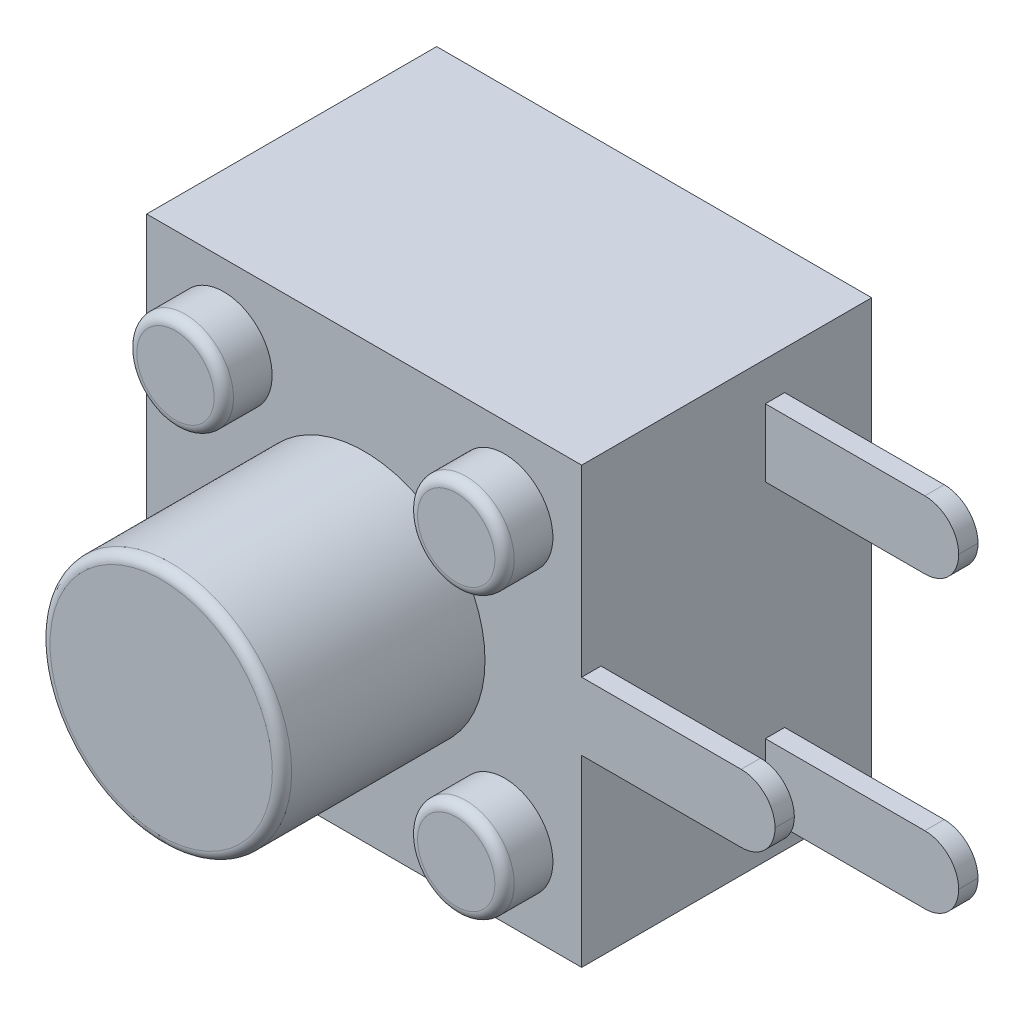
ISO-10303-21;
HEADER;
FILE_DESCRIPTION(('STEP AP214'),'2;1');
FILE_NAME('part.step','',(''),(''),'','','');
FILE_SCHEMA(('AUTOMOTIVE_DESIGN { 1 0 10303 214 1 1 1 1 }'));
ENDSEC;
DATA;
#1=APPLICATION_CONTEXT('core data for automotive mechanical design processes');
#2=APPLICATION_PROTOCOL_DEFINITION('international standard','automotive_design',2000,#1);
#3=PRODUCT_CONTEXT('',#1,'mechanical');
#4=PRODUCT('Part','Part','',(#3));
#5=PRODUCT_RELATED_PRODUCT_CATEGORY('part','',(#4));
#6=PRODUCT_DEFINITION_FORMATION('','',#4);
#7=PRODUCT_DEFINITION_CONTEXT('part definition',#1,'design');
#8=PRODUCT_DEFINITION('design','',#6,#7);
#9=PRODUCT_DEFINITION_SHAPE('','',#8);
#10=(LENGTH_UNIT() NAMED_UNIT(*) SI_UNIT(.MILLI.,.METRE.));
#11=(NAMED_UNIT(*) PLANE_ANGLE_UNIT() SI_UNIT($,.RADIAN.));
#12=(NAMED_UNIT(*) SI_UNIT($,.STERADIAN.) SOLID_ANGLE_UNIT());
#13=UNCERTAINTY_MEASURE_WITH_UNIT(LENGTH_MEASURE(1.E-05),#10,'distance_accuracy_value','');
#14=(GEOMETRIC_REPRESENTATION_CONTEXT(3) GLOBAL_UNCERTAINTY_ASSIGNED_CONTEXT((#13)) GLOBAL_UNIT_ASSIGNED_CONTEXT((#10,
#11,#12)) REPRESENTATION_CONTEXT('',''));
#15=CARTESIAN_POINT('',(0.,0.,0.));
#16=DIRECTION('',(0.,0.,1.));
#17=DIRECTION('',(1.,0.,0.));
#18=AXIS2_PLACEMENT_3D('',#15,#16,#17);
#19=CARTESIAN_POINT('',(2.25,-2.25,3.));
#20=DIRECTION('',(-1.,0.,0.));
#21=DIRECTION('',(0.,0.,1.));
#22=AXIS2_PLACEMENT_3D('',#19,#20,#21);
#23=PLANE('',#22);
#24=DIRECTION('',(0.,0.,1.));
#25=VECTOR('',#24,1.);
#26=CARTESIAN_POINT('',(2.25,0.349999999999999,2.8));
#27=LINE('',#26,#25);
#28=CARTESIAN_POINT('',(2.25,0.349999999999999,2.8));
#29=VERTEX_POINT('',#28);
#30=CARTESIAN_POINT('',(2.25,0.349999999999999,3.));
#31=VERTEX_POINT('',#30);
#32=EDGE_CURVE('E251',#29,#31,#27,.T.);
#33=ORIENTED_EDGE('',*,*,#32,.F.);
#34=DIRECTION('',(0.,-1.,0.));
#35=VECTOR('',#34,1.);
#36=CARTESIAN_POINT('',(2.25,-0.350000000000001,2.8));
#37=LINE('',#36,#35);
#38=CARTESIAN_POINT('',(2.25,-0.350000000000001,2.8));
#39=VERTEX_POINT('',#38);
#40=EDGE_CURVE('E233',#29,#39,#37,.T.);
#41=ORIENTED_EDGE('',*,*,#40,.T.);
#42=DIRECTION('',(0.,0.,1.));
#43=VECTOR('',#42,1.);
#44=CARTESIAN_POINT('',(2.25,-0.350000000000001,2.8));
#45=LINE('',#44,#43);
#46=CARTESIAN_POINT('',(2.25,-0.350000000000001,3.));
#47=VERTEX_POINT('',#46);
#48=EDGE_CURVE('E245',#39,#47,#45,.T.);
#49=ORIENTED_EDGE('',*,*,#48,.T.);
#50=DIRECTION('',(0.,1.,0.));
#51=VECTOR('',#50,1.);
#52=CARTESIAN_POINT('',(2.25,-2.25,3.));
#53=LINE('',#52,#51);
#54=CARTESIAN_POINT('',(2.25,-2.25,3.));
#55=VERTEX_POINT('',#54);
#56=EDGE_CURVE('E259',#55,#47,#53,.T.);
#57=ORIENTED_EDGE('',*,*,#56,.F.);
#58=DIRECTION('',(0.,0.,-1.));
#59=VECTOR('',#58,1.);
#60=CARTESIAN_POINT('',(2.25,-2.25,3.));
#61=LINE('',#60,#59);
#62=CARTESIAN_POINT('',(2.25,-2.25,0.));
#63=VERTEX_POINT('',#62);
#64=EDGE_CURVE('E273',#55,#63,#61,.T.);
#65=ORIENTED_EDGE('',*,*,#64,.T.);
#66=DIRECTION('',(0.,1.,0.));
#67=VECTOR('',#66,1.);
#68=CARTESIAN_POINT('',(2.25,-2.25,0.));
#69=LINE('',#68,#67);
#70=CARTESIAN_POINT('',(2.25,2.25,0.));
#71=VERTEX_POINT('',#70);
#72=EDGE_CURVE('E255',#63,#71,#69,.T.);
#73=ORIENTED_EDGE('',*,*,#72,.T.);
#74=DIRECTION('',(0.,0.,-1.));
#75=VECTOR('',#74,1.);
#76=CARTESIAN_POINT('',(2.25,2.25,3.));
#77=LINE('',#76,#75);
#78=CARTESIAN_POINT('',(2.25,2.25,3.));
#79=VERTEX_POINT('',#78);
#80=EDGE_CURVE('E297',#79,#71,#77,.T.);
#81=ORIENTED_EDGE('',*,*,#80,.F.);
#82=EDGE_CURVE('E264',#31,#79,#53,.T.);
#83=ORIENTED_EDGE('',*,*,#82,.F.);
#84=EDGE_LOOP('',(#33,#41,#49,#57,#65,#73,#81,#83));
#85=FACE_BOUND('',#84,.T.);
#86=DIRECTION('',(0.,0.,1.));
#87=VECTOR('',#86,1.);
#88=CARTESIAN_POINT('',(2.25,-1.15,0.9));
#89=LINE('',#88,#87);
#90=CARTESIAN_POINT('',(2.25,-1.15,0.9));
#91=VERTEX_POINT('',#90);
#92=CARTESIAN_POINT('',(2.25,-1.15,1.1));
#93=VERTEX_POINT('',#92);
#94=EDGE_CURVE('E228',#91,#93,#89,.T.);
#95=ORIENTED_EDGE('',*,*,#94,.F.);
#96=DIRECTION('',(0.,1.,0.));
#97=VECTOR('',#96,1.);
#98=CARTESIAN_POINT('',(2.25,-1.85,0.9));
#99=LINE('',#98,#97);
#100=CARTESIAN_POINT('',(2.25,-1.85,0.9));
#101=VERTEX_POINT('',#100);
#102=EDGE_CURVE('E208',#101,#91,#99,.T.);
#103=ORIENTED_EDGE('',*,*,#102,.F.);
#104=DIRECTION('',(0.,0.,1.));
#105=VECTOR('',#104,1.);
#106=CARTESIAN_POINT('',(2.25,-1.85,0.9));
#107=LINE('',#106,#105);
#108=CARTESIAN_POINT('',(2.25,-1.85,1.1));
#109=VERTEX_POINT('',#108);
#110=EDGE_CURVE('E218',#101,#109,#107,.T.);
#111=ORIENTED_EDGE('',*,*,#110,.T.);
#112=DIRECTION('',(0.,1.,0.));
#113=VECTOR('',#112,1.);
#114=CARTESIAN_POINT('',(2.25,-1.85,1.1));
#115=LINE('',#114,#113);
#116=EDGE_CURVE('E198',#109,#93,#115,.T.);
#117=ORIENTED_EDGE('',*,*,#116,.T.);
#118=EDGE_LOOP('',(#95,#103,#111,#117));
#119=FACE_BOUND('',#118,.T.);
#120=DIRECTION('',(0.,1.,0.));
#121=VECTOR('',#120,1.);
#122=CARTESIAN_POINT('',(2.25,1.85,0.9));
#123=LINE('',#122,#121);
#124=CARTESIAN_POINT('',(2.25,1.15,0.9));
#125=VERTEX_POINT('',#124);
#126=CARTESIAN_POINT('',(2.25,1.85,0.9));
#127=VERTEX_POINT('',#126);
#128=EDGE_CURVE('E183',#125,#127,#123,.T.);
#129=ORIENTED_EDGE('',*,*,#128,.F.);
#130=DIRECTION('',(0.,0.,1.));
#131=VECTOR('',#130,1.);
#132=CARTESIAN_POINT('',(2.25,1.15,0.9));
#133=LINE('',#132,#131);
#134=CARTESIAN_POINT('',(2.25,1.15,1.1));
#135=VERTEX_POINT('',#134);
#136=EDGE_CURVE('E199',#125,#135,#133,.T.);
#137=ORIENTED_EDGE('',*,*,#136,.T.);
#138=DIRECTION('',(0.,1.,0.));
#139=VECTOR('',#138,1.);
#140=CARTESIAN_POINT('',(2.25,1.85,1.1));
#141=LINE('',#140,#139);
#142=CARTESIAN_POINT('',(2.25,1.85,1.1));
#143=VERTEX_POINT('',#142);
#144=EDGE_CURVE('E196',#135,#143,#141,.T.);
#145=ORIENTED_EDGE('',*,*,#144,.T.);
#146=DIRECTION('',(0.,0.,1.));
#147=VECTOR('',#146,1.);
#148=CARTESIAN_POINT('',(2.25,1.85,0.9));
#149=LINE('',#148,#147);
#150=EDGE_CURVE('E176',#127,#143,#149,.T.);
#151=ORIENTED_EDGE('',*,*,#150,.F.);
#152=EDGE_LOOP('',(#129,#137,#145,#151));
#153=FACE_BOUND('',#152,.T.);
#154=ADVANCED_FACE('F41',(#85,#119,#153),#23,.F.);
#155=CARTESIAN_POINT('',(-2.25,2.25,3.));
#156=DIRECTION('',(0.,-1.,0.));
#157=DIRECTION('',(0.,0.,-1.));
#158=AXIS2_PLACEMENT_3D('',#155,#156,#157);
#159=PLANE('',#158);
#160=DIRECTION('',(-1.,0.,0.));
#161=VECTOR('',#160,1.);
#162=CARTESIAN_POINT('',(-2.25,2.25,0.));
#163=LINE('',#162,#161);
#164=CARTESIAN_POINT('',(-2.25,2.25,0.));
#165=VERTEX_POINT('',#164);
#166=EDGE_CURVE('E277',#71,#165,#163,.T.);
#167=ORIENTED_EDGE('',*,*,#166,.T.);
#168=DIRECTION('',(0.,0.,-1.));
#169=VECTOR('',#168,1.);
#170=CARTESIAN_POINT('',(-2.25,2.25,3.));
#171=LINE('',#170,#169);
#172=CARTESIAN_POINT('',(-2.25,2.25,3.));
#173=VERTEX_POINT('',#172);
#174=EDGE_CURVE('E293',#173,#165,#171,.T.);
#175=ORIENTED_EDGE('',*,*,#174,.F.);
#176=DIRECTION('',(-1.,0.,0.));
#177=VECTOR('',#176,1.);
#178=CARTESIAN_POINT('',(-2.25,2.25,3.));
#179=LINE('',#178,#177);
#180=EDGE_CURVE('E263',#79,#173,#179,.T.);
#181=ORIENTED_EDGE('',*,*,#180,.F.);
#182=ORIENTED_EDGE('',*,*,#80,.T.);
#183=EDGE_LOOP('',(#167,#175,#181,#182));
#184=FACE_BOUND('',#183,.T.);
#185=ADVANCED_FACE('F456',(#184),#159,.F.);
#186=CARTESIAN_POINT('',(-2.25,-2.25,3.));
#187=DIRECTION('',(1.,0.,0.));
#188=DIRECTION('',(0.,0.,-1.));
#189=AXIS2_PLACEMENT_3D('',#186,#187,#188);
#190=PLANE('',#189);
#191=DIRECTION('',(0.,-1.,0.));
#192=VECTOR('',#191,1.);
#193=CARTESIAN_POINT('',(-2.25,-2.25,0.));
#194=LINE('',#193,#192);
#195=CARTESIAN_POINT('',(-2.25,-2.25,0.));
#196=VERTEX_POINT('',#195);
#197=EDGE_CURVE('E280',#165,#196,#194,.T.);
#198=ORIENTED_EDGE('',*,*,#197,.T.);
#199=DIRECTION('',(0.,0.,-1.));
#200=VECTOR('',#199,1.);
#201=CARTESIAN_POINT('',(-2.25,-2.25,3.));
#202=LINE('',#201,#200);
#203=CARTESIAN_POINT('',(-2.25,-2.25,3.));
#204=VERTEX_POINT('',#203);
#205=EDGE_CURVE('E289',#204,#196,#202,.T.);
#206=ORIENTED_EDGE('',*,*,#205,.F.);
#207=DIRECTION('',(0.,-1.,0.));
#208=VECTOR('',#207,1.);
#209=CARTESIAN_POINT('',(-2.25,-2.25,3.));
#210=LINE('',#209,#208);
#211=EDGE_CURVE('E267',#173,#204,#210,.T.);
#212=ORIENTED_EDGE('',*,*,#211,.F.);
#213=ORIENTED_EDGE('',*,*,#174,.T.);
#214=EDGE_LOOP('',(#198,#206,#212,#213));
#215=FACE_BOUND('',#214,.T.);
#216=ADVANCED_FACE('F462',(#215),#190,.F.);
#217=CARTESIAN_POINT('',(-2.25,-2.25,3.));
#218=DIRECTION('',(0.,1.,0.));
#219=DIRECTION('',(0.,0.,1.));
#220=AXIS2_PLACEMENT_3D('',#217,#218,#219);
#221=PLANE('',#220);
#222=DIRECTION('',(1.,0.,0.));
#223=VECTOR('',#222,1.);
#224=CARTESIAN_POINT('',(-2.25,-2.25,0.));
#225=LINE('',#224,#223);
#226=EDGE_CURVE('E283',#196,#63,#225,.T.);
#227=ORIENTED_EDGE('',*,*,#226,.T.);
#228=ORIENTED_EDGE('',*,*,#64,.F.);
#229=DIRECTION('',(1.,0.,0.));
#230=VECTOR('',#229,1.);
#231=CARTESIAN_POINT('',(-2.25,-2.25,3.));
#232=LINE('',#231,#230);
#233=EDGE_CURVE('E270',#204,#55,#232,.T.);
#234=ORIENTED_EDGE('',*,*,#233,.F.);
#235=ORIENTED_EDGE('',*,*,#205,.T.);
#236=EDGE_LOOP('',(#227,#228,#234,#235));
#237=FACE_BOUND('',#236,.T.);
#238=ADVANCED_FACE('F612',(#237),#221,.F.);
#239=CARTESIAN_POINT('',(0.,0.,3.));
#240=DIRECTION('',(0.,0.,-1.));
#241=DIRECTION('',(-1.,0.,0.));
#242=AXIS2_PLACEMENT_3D('',#239,#240,#241);
#243=PLANE('',#242);
#244=CARTESIAN_POINT('',(0.,0.,3.));
#245=DIRECTION('',(0.,0.,-1.));
#246=DIRECTION('',(-1.,0.,0.));
#247=AXIS2_PLACEMENT_3D('',#244,#245,#246);
#248=CIRCLE('',#247,1.25);
#249=CARTESIAN_POINT('',(-1.25,0.,3.));
#250=VERTEX_POINT('',#249);
#251=EDGE_CURVE('E349',#250,#250,#248,.F.);
#252=ORIENTED_EDGE('',*,*,#251,.F.);
#253=EDGE_LOOP('',(#252));
#254=FACE_BOUND('',#253,.T.);
#255=CARTESIAN_POINT('',(-1.45218188956164,-1.45218188956164,3.));
#256=DIRECTION('',(0.,0.,-1.));
#257=DIRECTION('',(-1.,0.,0.));
#258=AXIS2_PLACEMENT_3D('',#255,#256,#257);
#259=CIRCLE('',#258,0.5);
#260=CARTESIAN_POINT('',(-1.95218188956164,-1.45218188956164,3.));
#261=VERTEX_POINT('',#260);
#262=EDGE_CURVE('E313',#261,#261,#259,.F.);
#263=ORIENTED_EDGE('',*,*,#262,.F.);
#264=EDGE_LOOP('',(#263));
#265=FACE_BOUND('',#264,.T.);
#266=CARTESIAN_POINT('',(1.45218188956164,-1.45218188956164,3.));
#267=DIRECTION('',(0.,0.,-1.));
#268=DIRECTION('',(-1.,0.,0.));
#269=AXIS2_PLACEMENT_3D('',#266,#267,#268);
#270=CIRCLE('',#269,0.5);
#271=CARTESIAN_POINT('',(0.952181889561643,-1.45218188956164,3.));
#272=VERTEX_POINT('',#271);
#273=EDGE_CURVE('E309',#272,#272,#270,.F.);
#274=ORIENTED_EDGE('',*,*,#273,.F.);
#275=EDGE_LOOP('',(#274));
#276=FACE_BOUND('',#275,.T.);
#277=CARTESIAN_POINT('',(1.45218188956164,1.45218188956164,3.));
#278=DIRECTION('',(0.,0.,-1.));
#279=DIRECTION('',(-1.,0.,0.));
#280=AXIS2_PLACEMENT_3D('',#277,#278,#279);
#281=CIRCLE('',#280,0.5);
#282=CARTESIAN_POINT('',(0.952181889561643,1.45218188956164,3.));
#283=VERTEX_POINT('',#282);
#284=EDGE_CURVE('E305',#283,#283,#281,.F.);
#285=ORIENTED_EDGE('',*,*,#284,.F.);
#286=EDGE_LOOP('',(#285));
#287=FACE_BOUND('',#286,.T.);
#288=CARTESIAN_POINT('',(-1.45218188956164,1.45218188956164,3.));
#289=DIRECTION('',(0.,0.,-1.));
#290=DIRECTION('',(-1.,0.,0.));
#291=AXIS2_PLACEMENT_3D('',#288,#289,#290);
#292=CIRCLE('',#291,0.5);
#293=CARTESIAN_POINT('',(-1.95218188956164,1.45218188956164,3.));
#294=VERTEX_POINT('',#293);
#295=EDGE_CURVE('E301',#294,#294,#292,.F.);
#296=ORIENTED_EDGE('',*,*,#295,.F.);
#297=EDGE_LOOP('',(#296));
#298=FACE_BOUND('',#297,.T.);
#299=DIRECTION('',(1.,0.,0.));
#300=VECTOR('',#299,1.);
#301=CARTESIAN_POINT('',(4.25,-0.35,3.));
#302=LINE('',#301,#300);
#303=CARTESIAN_POINT('',(3.9,-0.35,3.));
#304=VERTEX_POINT('',#303);
#305=EDGE_CURVE('E232',#47,#304,#302,.T.);
#306=ORIENTED_EDGE('',*,*,#305,.T.);
#307=CARTESIAN_POINT('',(3.9,0.,3.));
#308=DIRECTION('',(0.,0.,-1.));
#309=DIRECTION('',(-1.,0.,0.));
#310=AXIS2_PLACEMENT_3D('',#307,#308,#309);
#311=CIRCLE('',#310,0.35);
#312=CARTESIAN_POINT('',(4.25,0.,3.));
#313=VERTEX_POINT('',#312);
#314=EDGE_CURVE('E385',#304,#313,#311,.F.);
#315=ORIENTED_EDGE('',*,*,#314,.T.);
#316=CARTESIAN_POINT('',(3.9,0.,3.));
#317=DIRECTION('',(0.,0.,-1.));
#318=DIRECTION('',(-1.,0.,0.));
#319=AXIS2_PLACEMENT_3D('',#316,#317,#318);
#320=CIRCLE('',#319,0.35);
#321=CARTESIAN_POINT('',(3.9,0.35,3.));
#322=VERTEX_POINT('',#321);
#323=EDGE_CURVE('E382',#313,#322,#320,.F.);
#324=ORIENTED_EDGE('',*,*,#323,.T.);
#325=DIRECTION('',(-1.,0.,0.));
#326=VECTOR('',#325,1.);
#327=CARTESIAN_POINT('',(4.25,0.35,3.));
#328=LINE('',#327,#326);
#329=EDGE_CURVE('E238',#322,#31,#328,.T.);
#330=ORIENTED_EDGE('',*,*,#329,.T.);
#331=ORIENTED_EDGE('',*,*,#82,.T.);
#332=ORIENTED_EDGE('',*,*,#180,.T.);
#333=ORIENTED_EDGE('',*,*,#211,.T.);
#334=ORIENTED_EDGE('',*,*,#233,.T.);
#335=ORIENTED_EDGE('',*,*,#56,.T.);
#336=EDGE_LOOP('',(#306,#315,#324,#330,#331,#332,#333,#334,#335));
#337=FACE_BOUND('',#336,.T.);
#338=ADVANCED_FACE('F607',(#254,#265,#276,#287,#298,#337),#243,.F.);
#339=CARTESIAN_POINT('',(0.,0.,0.));
#340=DIRECTION('',(0.,0.,-1.));
#341=DIRECTION('',(-1.,0.,0.));
#342=AXIS2_PLACEMENT_3D('',#339,#340,#341);
#343=PLANE('',#342);
#344=ORIENTED_EDGE('',*,*,#72,.F.);
#345=ORIENTED_EDGE('',*,*,#226,.F.);
#346=ORIENTED_EDGE('',*,*,#197,.F.);
#347=ORIENTED_EDGE('',*,*,#166,.F.);
#348=EDGE_LOOP('',(#344,#345,#346,#347));
#349=FACE_BOUND('',#348,.T.);
#350=ADVANCED_FACE('F611',(#349),#343,.T.);
#351=CARTESIAN_POINT('',(-1.45218188956164,1.45218188956164,3.5));
#352=DIRECTION('',(0.,0.,-1.));
#353=DIRECTION('',(-1.,0.,0.));
#354=AXIS2_PLACEMENT_3D('',#351,#352,#353);
#355=CYLINDRICAL_SURFACE('',#354,0.5);
#356=CARTESIAN_POINT('',(-1.45218188956164,1.45218188956164,3.4));
#357=DIRECTION('',(0.,0.,1.));
#358=DIRECTION('',(1.,0.,0.));
#359=AXIS2_PLACEMENT_3D('',#356,#357,#358);
#360=CIRCLE('',#359,0.5);
#361=CARTESIAN_POINT('',(-0.952181889561644,1.45218188956164,3.4));
#362=VERTEX_POINT('',#361);
#363=EDGE_CURVE('E345',#362,#362,#360,.F.);
#364=ORIENTED_EDGE('',*,*,#363,.T.);
#365=EDGE_LOOP('',(#364));
#366=FACE_BOUND('',#365,.T.);
#367=ORIENTED_EDGE('',*,*,#295,.T.);
#368=EDGE_LOOP('',(#367));
#369=FACE_BOUND('',#368,.T.);
#370=ADVANCED_FACE('F742',(#366,#369),#355,.T.);
#371=CARTESIAN_POINT('',(-1.45218188956164,1.45218188956164,3.5));
#372=DIRECTION('',(0.,0.,1.));
#373=DIRECTION('',(1.,0.,0.));
#374=AXIS2_PLACEMENT_3D('',#371,#372,#373);
#375=PLANE('',#374);
#376=CARTESIAN_POINT('',(-1.45218188956164,1.45218188956164,3.5));
#377=DIRECTION('',(0.,0.,1.));
#378=DIRECTION('',(1.,0.,0.));
#379=AXIS2_PLACEMENT_3D('',#376,#377,#378);
#380=CIRCLE('',#379,0.4);
#381=CARTESIAN_POINT('',(-1.05218188956164,1.45218188956164,3.5));
#382=VERTEX_POINT('',#381);
#383=EDGE_CURVE('E341',#382,#382,#380,.T.);
#384=ORIENTED_EDGE('',*,*,#383,.T.);
#385=EDGE_LOOP('',(#384));
#386=FACE_BOUND('',#385,.T.);
#387=ADVANCED_FACE('F732',(#386),#375,.T.);
#388=CARTESIAN_POINT('',(1.45218188956164,1.45218188956164,3.5));
#389=DIRECTION('',(0.,0.,-1.));
#390=DIRECTION('',(-1.,0.,0.));
#391=AXIS2_PLACEMENT_3D('',#388,#389,#390);
#392=CYLINDRICAL_SURFACE('',#391,0.5);
#393=CARTESIAN_POINT('',(1.45218188956164,1.45218188956164,3.4));
#394=DIRECTION('',(0.,0.,-1.));
#395=DIRECTION('',(-1.,0.,0.));
#396=AXIS2_PLACEMENT_3D('',#393,#394,#395);
#397=CIRCLE('',#396,0.5);
#398=CARTESIAN_POINT('',(0.952181889561643,1.45218188956164,3.4));
#399=VERTEX_POINT('',#398);
#400=EDGE_CURVE('E321',#399,#399,#397,.T.);
#401=ORIENTED_EDGE('',*,*,#400,.T.);
#402=EDGE_LOOP('',(#401));
#403=FACE_BOUND('',#402,.T.);
#404=ORIENTED_EDGE('',*,*,#284,.T.);
#405=EDGE_LOOP('',(#404));
#406=FACE_BOUND('',#405,.T.);
#407=ADVANCED_FACE('F722',(#403,#406),#392,.T.);
#408=CARTESIAN_POINT('',(1.45218188956164,1.45218188956164,3.5));
#409=DIRECTION('',(0.,0.,-1.));
#410=DIRECTION('',(-1.,0.,0.));
#411=AXIS2_PLACEMENT_3D('',#408,#409,#410);
#412=PLANE('',#411);
#413=CARTESIAN_POINT('',(1.45218188956164,1.45218188956164,3.5));
#414=DIRECTION('',(0.,0.,-1.));
#415=DIRECTION('',(-1.,0.,0.));
#416=AXIS2_PLACEMENT_3D('',#413,#414,#415);
#417=CIRCLE('',#416,0.4);
#418=CARTESIAN_POINT('',(1.05218188956164,1.45218188956164,3.5));
#419=VERTEX_POINT('',#418);
#420=EDGE_CURVE('E317',#419,#419,#417,.F.);
#421=ORIENTED_EDGE('',*,*,#420,.T.);
#422=EDGE_LOOP('',(#421));
#423=FACE_BOUND('',#422,.T.);
#424=ADVANCED_FACE('F712',(#423),#412,.F.);
#425=CARTESIAN_POINT('',(1.45218188956164,-1.45218188956164,3.5));
#426=DIRECTION('',(0.,0.,-1.));
#427=DIRECTION('',(-1.,0.,0.));
#428=AXIS2_PLACEMENT_3D('',#425,#426,#427);
#429=CYLINDRICAL_SURFACE('',#428,0.5);
#430=CARTESIAN_POINT('',(1.45218188956164,-1.45218188956164,3.4));
#431=DIRECTION('',(0.,0.,1.));
#432=DIRECTION('',(1.,0.,0.));
#433=AXIS2_PLACEMENT_3D('',#430,#431,#432);
#434=CIRCLE('',#433,0.5);
#435=CARTESIAN_POINT('',(1.95218188956164,-1.45218188956164,3.4));
#436=VERTEX_POINT('',#435);
#437=EDGE_CURVE('E329',#436,#436,#434,.F.);
#438=ORIENTED_EDGE('',*,*,#437,.T.);
#439=EDGE_LOOP('',(#438));
#440=FACE_BOUND('',#439,.T.);
#441=ORIENTED_EDGE('',*,*,#273,.T.);
#442=EDGE_LOOP('',(#441));
#443=FACE_BOUND('',#442,.T.);
#444=ADVANCED_FACE('F702',(#440,#443),#429,.T.);
#445=CARTESIAN_POINT('',(1.45218188956164,-1.45218188956164,3.5));
#446=DIRECTION('',(0.,0.,1.));
#447=DIRECTION('',(1.,0.,0.));
#448=AXIS2_PLACEMENT_3D('',#445,#446,#447);
#449=PLANE('',#448);
#450=CARTESIAN_POINT('',(1.45218188956164,-1.45218188956164,3.5));
#451=DIRECTION('',(0.,0.,1.));
#452=DIRECTION('',(1.,0.,0.));
#453=AXIS2_PLACEMENT_3D('',#450,#451,#452);
#454=CIRCLE('',#453,0.4);
#455=CARTESIAN_POINT('',(1.85218188956164,-1.45218188956164,3.5));
#456=VERTEX_POINT('',#455);
#457=EDGE_CURVE('E325',#456,#456,#454,.T.);
#458=ORIENTED_EDGE('',*,*,#457,.T.);
#459=EDGE_LOOP('',(#458));
#460=FACE_BOUND('',#459,.T.);
#461=ADVANCED_FACE('F692',(#460),#449,.T.);
#462=CARTESIAN_POINT('',(-1.45218188956164,-1.45218188956164,3.5));
#463=DIRECTION('',(0.,0.,-1.));
#464=DIRECTION('',(-1.,0.,0.));
#465=AXIS2_PLACEMENT_3D('',#462,#463,#464);
#466=CYLINDRICAL_SURFACE('',#465,0.5);
#467=CARTESIAN_POINT('',(-1.45218188956164,-1.45218188956164,3.4));
#468=DIRECTION('',(0.,0.,-1.));
#469=DIRECTION('',(-1.,0.,0.));
#470=AXIS2_PLACEMENT_3D('',#467,#468,#469);
#471=CIRCLE('',#470,0.5);
#472=CARTESIAN_POINT('',(-1.95218188956164,-1.45218188956164,3.4));
#473=VERTEX_POINT('',#472);
#474=EDGE_CURVE('E337',#473,#473,#471,.T.);
#475=ORIENTED_EDGE('',*,*,#474,.T.);
#476=EDGE_LOOP('',(#475));
#477=FACE_BOUND('',#476,.T.);
#478=ORIENTED_EDGE('',*,*,#262,.T.);
#479=EDGE_LOOP('',(#478));
#480=FACE_BOUND('',#479,.T.);
#481=ADVANCED_FACE('F682',(#477,#480),#466,.T.);
#482=CARTESIAN_POINT('',(-1.45218188956164,-1.45218188956164,3.5));
#483=DIRECTION('',(0.,0.,-1.));
#484=DIRECTION('',(-1.,0.,0.));
#485=AXIS2_PLACEMENT_3D('',#482,#483,#484);
#486=PLANE('',#485);
#487=CARTESIAN_POINT('',(-1.45218188956164,-1.45218188956164,3.5));
#488=DIRECTION('',(0.,0.,-1.));
#489=DIRECTION('',(-1.,0.,0.));
#490=AXIS2_PLACEMENT_3D('',#487,#488,#489);
#491=CIRCLE('',#490,0.4);
#492=CARTESIAN_POINT('',(-1.85218188956164,-1.45218188956164,3.5));
#493=VERTEX_POINT('',#492);
#494=EDGE_CURVE('E333',#493,#493,#491,.F.);
#495=ORIENTED_EDGE('',*,*,#494,.T.);
#496=EDGE_LOOP('',(#495));
#497=FACE_BOUND('',#496,.T.);
#498=ADVANCED_FACE('F472',(#497),#486,.F.);
#499=CARTESIAN_POINT('',(1.45218188956164,1.45218188956164,3.4));
#500=DIRECTION('',(0.,0.,-1.));
#501=DIRECTION('',(-1.,0.,0.));
#502=AXIS2_PLACEMENT_3D('',#499,#500,#501);
#503=TOROIDAL_SURFACE('',#502,0.4,0.1);
#504=ORIENTED_EDGE('',*,*,#400,.F.);
#505=EDGE_LOOP('',(#504));
#506=FACE_BOUND('',#505,.T.);
#507=ORIENTED_EDGE('',*,*,#420,.F.);
#508=EDGE_LOOP('',(#507));
#509=FACE_BOUND('',#508,.T.);
#510=ADVANCED_FACE('F468',(#506,#509),#503,.T.);
#511=CARTESIAN_POINT('',(1.45218188956164,-1.45218188956164,3.4));
#512=DIRECTION('',(0.,0.,1.));
#513=DIRECTION('',(1.,0.,0.));
#514=AXIS2_PLACEMENT_3D('',#511,#512,#513);
#515=TOROIDAL_SURFACE('',#514,0.4,0.1);
#516=ORIENTED_EDGE('',*,*,#437,.F.);
#517=EDGE_LOOP('',(#516));
#518=FACE_BOUND('',#517,.T.);
#519=ORIENTED_EDGE('',*,*,#457,.F.);
#520=EDGE_LOOP('',(#519));
#521=FACE_BOUND('',#520,.T.);
#522=ADVANCED_FACE('F471',(#518,#521),#515,.T.);
#523=CARTESIAN_POINT('',(-1.45218188956164,-1.45218188956164,3.4));
#524=DIRECTION('',(0.,0.,-1.));
#525=DIRECTION('',(-1.,0.,0.));
#526=AXIS2_PLACEMENT_3D('',#523,#524,#525);
#527=TOROIDAL_SURFACE('',#526,0.4,0.1);
#528=ORIENTED_EDGE('',*,*,#474,.F.);
#529=EDGE_LOOP('',(#528));
#530=FACE_BOUND('',#529,.T.);
#531=ORIENTED_EDGE('',*,*,#494,.F.);
#532=EDGE_LOOP('',(#531));
#533=FACE_BOUND('',#532,.T.);
#534=ADVANCED_FACE('F476',(#530,#533),#527,.T.);
#535=CARTESIAN_POINT('',(-1.45218188956164,1.45218188956164,3.4));
#536=DIRECTION('',(0.,0.,1.));
#537=DIRECTION('',(1.,0.,0.));
#538=AXIS2_PLACEMENT_3D('',#535,#536,#537);
#539=TOROIDAL_SURFACE('',#538,0.4,0.1);
#540=ORIENTED_EDGE('',*,*,#363,.F.);
#541=EDGE_LOOP('',(#540));
#542=FACE_BOUND('',#541,.T.);
#543=ORIENTED_EDGE('',*,*,#383,.F.);
#544=EDGE_LOOP('',(#543));
#545=FACE_BOUND('',#544,.T.);
#546=ADVANCED_FACE('F480',(#542,#545),#539,.T.);
#547=CARTESIAN_POINT('',(0.,0.,5.1));
#548=DIRECTION('',(0.,0.,-1.));
#549=DIRECTION('',(-1.,0.,0.));
#550=AXIS2_PLACEMENT_3D('',#547,#548,#549);
#551=CYLINDRICAL_SURFACE('',#550,1.25);
#552=CARTESIAN_POINT('',(0.,0.,5.));
#553=DIRECTION('',(0.,0.,1.));
#554=DIRECTION('',(1.,0.,0.));
#555=AXIS2_PLACEMENT_3D('',#552,#553,#554);
#556=CIRCLE('',#555,1.25);
#557=CARTESIAN_POINT('',(1.25,0.,5.));
#558=VERTEX_POINT('',#557);
#559=EDGE_CURVE('E357',#558,#558,#556,.F.);
#560=ORIENTED_EDGE('',*,*,#559,.T.);
#561=EDGE_LOOP('',(#560));
#562=FACE_BOUND('',#561,.T.);
#563=ORIENTED_EDGE('',*,*,#251,.T.);
#564=EDGE_LOOP('',(#563));
#565=FACE_BOUND('',#564,.T.);
#566=ADVANCED_FACE('F484',(#562,#565),#551,.T.);
#567=CARTESIAN_POINT('',(0.,0.,5.1));
#568=DIRECTION('',(0.,0.,1.));
#569=DIRECTION('',(1.,0.,0.));
#570=AXIS2_PLACEMENT_3D('',#567,#568,#569);
#571=PLANE('',#570);
#572=CARTESIAN_POINT('',(0.,0.,5.1));
#573=DIRECTION('',(0.,0.,1.));
#574=DIRECTION('',(1.,0.,0.));
#575=AXIS2_PLACEMENT_3D('',#572,#573,#574);
#576=CIRCLE('',#575,1.15);
#577=CARTESIAN_POINT('',(1.15,0.,5.1));
#578=VERTEX_POINT('',#577);
#579=EDGE_CURVE('E353',#578,#578,#576,.T.);
#580=ORIENTED_EDGE('',*,*,#579,.T.);
#581=EDGE_LOOP('',(#580));
#582=FACE_BOUND('',#581,.T.);
#583=ADVANCED_FACE('F490',(#582),#571,.T.);
#584=CARTESIAN_POINT('',(0.,0.,5.));
#585=DIRECTION('',(0.,0.,1.));
#586=DIRECTION('',(1.,0.,0.));
#587=AXIS2_PLACEMENT_3D('',#584,#585,#586);
#588=TOROIDAL_SURFACE('',#587,1.15,0.1);
#589=ORIENTED_EDGE('',*,*,#559,.F.);
#590=EDGE_LOOP('',(#589));
#591=FACE_BOUND('',#590,.T.);
#592=ORIENTED_EDGE('',*,*,#579,.F.);
#593=EDGE_LOOP('',(#592));
#594=FACE_BOUND('',#593,.T.);
#595=ADVANCED_FACE('F486',(#591,#594),#588,.T.);
#596=CARTESIAN_POINT('',(4.25,0.35,2.8));
#597=DIRECTION('',(0.,1.,0.));
#598=DIRECTION('',(-1.,0.,0.));
#599=AXIS2_PLACEMENT_3D('',#596,#597,#598);
#600=PLANE('',#599);
#601=ORIENTED_EDGE('',*,*,#329,.F.);
#602=DIRECTION('',(0.,0.,1.));
#603=VECTOR('',#602,1.);
#604=CARTESIAN_POINT('',(3.9,0.35,2.8));
#605=LINE('',#604,#603);
#606=CARTESIAN_POINT('',(3.9,0.35,2.8));
#607=VERTEX_POINT('',#606);
#608=EDGE_CURVE('E394',#322,#607,#605,.F.);
#609=ORIENTED_EDGE('',*,*,#608,.T.);
#610=DIRECTION('',(-1.,0.,0.));
#611=VECTOR('',#610,1.);
#612=CARTESIAN_POINT('',(4.25,0.35,2.8));
#613=LINE('',#612,#611);
#614=EDGE_CURVE('E242',#607,#29,#613,.T.);
#615=ORIENTED_EDGE('',*,*,#614,.T.);
#616=ORIENTED_EDGE('',*,*,#32,.T.);
#617=EDGE_LOOP('',(#601,#609,#615,#616));
#618=FACE_BOUND('',#617,.T.);
#619=ADVANCED_FACE('F489',(#618),#600,.T.);
#620=CARTESIAN_POINT('',(4.25,-0.35,2.8));
#621=DIRECTION('',(0.,-1.,0.));
#622=DIRECTION('',(1.,0.,0.));
#623=AXIS2_PLACEMENT_3D('',#620,#621,#622);
#624=PLANE('',#623);
#625=DIRECTION('',(1.,0.,0.));
#626=VECTOR('',#625,1.);
#627=CARTESIAN_POINT('',(4.25,-0.35,2.8));
#628=LINE('',#627,#626);
#629=CARTESIAN_POINT('',(3.9,-0.35,2.8));
#630=VERTEX_POINT('',#629);
#631=EDGE_CURVE('E237',#39,#630,#628,.T.);
#632=ORIENTED_EDGE('',*,*,#631,.T.);
#633=DIRECTION('',(0.,0.,1.));
#634=VECTOR('',#633,1.);
#635=CARTESIAN_POINT('',(3.9,-0.35,2.8));
#636=LINE('',#635,#634);
#637=EDGE_CURVE('E378',#630,#304,#636,.T.);
#638=ORIENTED_EDGE('',*,*,#637,.T.);
#639=ORIENTED_EDGE('',*,*,#305,.F.);
#640=ORIENTED_EDGE('',*,*,#48,.F.);
#641=EDGE_LOOP('',(#632,#638,#639,#640));
#642=FACE_BOUND('',#641,.T.);
#643=ADVANCED_FACE('F452',(#642),#624,.T.);
#644=CARTESIAN_POINT('',(0.,0.,2.8));
#645=DIRECTION('',(0.,0.,1.));
#646=DIRECTION('',(1.,0.,0.));
#647=AXIS2_PLACEMENT_3D('',#644,#645,#646);
#648=PLANE('',#647);
#649=CARTESIAN_POINT('',(3.9,0.,2.8));
#650=DIRECTION('',(0.,0.,1.));
#651=DIRECTION('',(1.,0.,0.));
#652=AXIS2_PLACEMENT_3D('',#649,#650,#651);
#653=CIRCLE('',#652,0.35);
#654=CARTESIAN_POINT('',(4.25,0.,2.8));
#655=VERTEX_POINT('',#654);
#656=EDGE_CURVE('E388',#607,#655,#653,.F.);
#657=ORIENTED_EDGE('',*,*,#656,.T.);
#658=CARTESIAN_POINT('',(3.9,0.,2.8));
#659=DIRECTION('',(0.,0.,1.));
#660=DIRECTION('',(1.,0.,0.));
#661=AXIS2_PLACEMENT_3D('',#658,#659,#660);
#662=CIRCLE('',#661,0.35);
#663=EDGE_CURVE('E391',#655,#630,#662,.F.);
#664=ORIENTED_EDGE('',*,*,#663,.T.);
#665=ORIENTED_EDGE('',*,*,#631,.F.);
#666=ORIENTED_EDGE('',*,*,#40,.F.);
#667=ORIENTED_EDGE('',*,*,#614,.F.);
#668=EDGE_LOOP('',(#657,#664,#665,#666,#667));
#669=FACE_BOUND('',#668,.T.);
#670=ADVANCED_FACE('F445',(#669),#648,.F.);
#671=CARTESIAN_POINT('',(2.25,-1.15,0.9));
#672=DIRECTION('',(0.,-1.,0.));
#673=DIRECTION('',(1.,0.,0.));
#674=AXIS2_PLACEMENT_3D('',#671,#672,#673);
#675=PLANE('',#674);
#676=DIRECTION('',(1.,0.,0.));
#677=VECTOR('',#676,1.);
#678=CARTESIAN_POINT('',(2.25,-1.15,1.1));
#679=LINE('',#678,#677);
#680=CARTESIAN_POINT('',(3.9,-1.15,1.1));
#681=VERTEX_POINT('',#680);
#682=EDGE_CURVE('E203',#93,#681,#679,.T.);
#683=ORIENTED_EDGE('',*,*,#682,.T.);
#684=DIRECTION('',(0.,0.,1.));
#685=VECTOR('',#684,1.);
#686=CARTESIAN_POINT('',(3.9,-1.15,0.9));
#687=LINE('',#686,#685);
#688=CARTESIAN_POINT('',(3.9,-1.15,0.9));
#689=VERTEX_POINT('',#688);
#690=EDGE_CURVE('E403',#681,#689,#687,.F.);
#691=ORIENTED_EDGE('',*,*,#690,.T.);
#692=DIRECTION('',(1.,0.,0.));
#693=VECTOR('',#692,1.);
#694=CARTESIAN_POINT('',(2.25,-1.15,0.9));
#695=LINE('',#694,#693);
#696=EDGE_CURVE('E212',#91,#689,#695,.T.);
#697=ORIENTED_EDGE('',*,*,#696,.F.);
#698=ORIENTED_EDGE('',*,*,#94,.T.);
#699=EDGE_LOOP('',(#683,#691,#697,#698));
#700=FACE_BOUND('',#699,.T.);
#701=ADVANCED_FACE('F443',(#700),#675,.F.);
#702=CARTESIAN_POINT('',(2.25,-1.85,0.9));
#703=DIRECTION('',(0.,1.,0.));
#704=DIRECTION('',(-1.,0.,0.));
#705=AXIS2_PLACEMENT_3D('',#702,#703,#704);
#706=PLANE('',#705);
#707=DIRECTION('',(-1.,0.,0.));
#708=VECTOR('',#707,1.);
#709=CARTESIAN_POINT('',(2.25,-1.85,0.9));
#710=LINE('',#709,#708);
#711=CARTESIAN_POINT('',(3.9,-1.85,0.9));
#712=VERTEX_POINT('',#711);
#713=EDGE_CURVE('E216',#712,#101,#710,.T.);
#714=ORIENTED_EDGE('',*,*,#713,.F.);
#715=DIRECTION('',(0.,0.,1.));
#716=VECTOR('',#715,1.);
#717=CARTESIAN_POINT('',(3.9,-1.85,0.9));
#718=LINE('',#717,#716);
#719=CARTESIAN_POINT('',(3.9,-1.85,1.1));
#720=VERTEX_POINT('',#719);
#721=EDGE_CURVE('E11',#712,#720,#718,.T.);
#722=ORIENTED_EDGE('',*,*,#721,.T.);
#723=DIRECTION('',(-1.,0.,0.));
#724=VECTOR('',#723,1.);
#725=CARTESIAN_POINT('',(2.25,-1.85,1.1));
#726=LINE('',#725,#724);
#727=EDGE_CURVE('E213',#720,#109,#726,.T.);
#728=ORIENTED_EDGE('',*,*,#727,.T.);
#729=ORIENTED_EDGE('',*,*,#110,.F.);
#730=EDGE_LOOP('',(#714,#722,#728,#729));
#731=FACE_BOUND('',#730,.T.);
#732=ADVANCED_FACE('F432',(#731),#706,.F.);
#733=CARTESIAN_POINT('',(0.,0.,0.9));
#734=DIRECTION('',(0.,0.,-1.));
#735=DIRECTION('',(-1.,0.,0.));
#736=AXIS2_PLACEMENT_3D('',#733,#734,#735);
#737=PLANE('',#736);
#738=ORIENTED_EDGE('',*,*,#696,.T.);
#739=CARTESIAN_POINT('',(3.9,-1.5,0.9));
#740=DIRECTION('',(0.,0.,-1.));
#741=DIRECTION('',(-1.,0.,0.));
#742=AXIS2_PLACEMENT_3D('',#739,#740,#741);
#743=CIRCLE('',#742,0.35);
#744=CARTESIAN_POINT('',(4.25,-1.5,0.9));
#745=VERTEX_POINT('',#744);
#746=EDGE_CURVE('E51',#689,#745,#743,.T.);
#747=ORIENTED_EDGE('',*,*,#746,.T.);
#748=CARTESIAN_POINT('',(3.9,-1.5,0.9));
#749=DIRECTION('',(0.,0.,-1.));
#750=DIRECTION('',(-1.,0.,0.));
#751=AXIS2_PLACEMENT_3D('',#748,#749,#750);
#752=CIRCLE('',#751,0.35);
#753=EDGE_CURVE('E59',#745,#712,#752,.T.);
#754=ORIENTED_EDGE('',*,*,#753,.T.);
#755=ORIENTED_EDGE('',*,*,#713,.T.);
#756=ORIENTED_EDGE('',*,*,#102,.T.);
#757=EDGE_LOOP('',(#738,#747,#754,#755,#756));
#758=FACE_BOUND('',#757,.T.);
#759=ADVANCED_FACE('F441',(#758),#737,.T.);
#760=CARTESIAN_POINT('',(0.,0.,1.1));
#761=DIRECTION('',(0.,0.,-1.));
#762=DIRECTION('',(-1.,0.,0.));
#763=AXIS2_PLACEMENT_3D('',#760,#761,#762);
#764=PLANE('',#763);
#765=CARTESIAN_POINT('',(3.9,-1.5,1.1));
#766=DIRECTION('',(0.,0.,-1.));
#767=DIRECTION('',(-1.,0.,0.));
#768=AXIS2_PLACEMENT_3D('',#765,#766,#767);
#769=CIRCLE('',#768,0.35);
#770=CARTESIAN_POINT('',(4.25,-1.5,1.1));
#771=VERTEX_POINT('',#770);
#772=EDGE_CURVE('E397',#720,#771,#769,.F.);
#773=ORIENTED_EDGE('',*,*,#772,.T.);
#774=CARTESIAN_POINT('',(3.9,-1.5,1.1));
#775=DIRECTION('',(0.,0.,-1.));
#776=DIRECTION('',(-1.,0.,0.));
#777=AXIS2_PLACEMENT_3D('',#774,#775,#776);
#778=CIRCLE('',#777,0.35);
#779=EDGE_CURVE('E400',#771,#681,#778,.F.);
#780=ORIENTED_EDGE('',*,*,#779,.T.);
#781=ORIENTED_EDGE('',*,*,#682,.F.);
#782=ORIENTED_EDGE('',*,*,#116,.F.);
#783=ORIENTED_EDGE('',*,*,#727,.F.);
#784=EDGE_LOOP('',(#773,#780,#781,#782,#783));
#785=FACE_BOUND('',#784,.T.);
#786=ADVANCED_FACE('F436',(#785),#764,.F.);
#787=CARTESIAN_POINT('',(2.25,1.85,0.9));
#788=DIRECTION('',(0.,-1.,0.));
#789=DIRECTION('',(1.,0.,0.));
#790=AXIS2_PLACEMENT_3D('',#787,#788,#789);
#791=PLANE('',#790);
#792=DIRECTION('',(1.,0.,0.));
#793=VECTOR('',#792,1.);
#794=CARTESIAN_POINT('',(2.25,1.85,1.1));
#795=LINE('',#794,#793);
#796=CARTESIAN_POINT('',(3.9,1.85,1.1));
#797=VERTEX_POINT('',#796);
#798=EDGE_CURVE('E884',#143,#797,#795,.T.);
#799=ORIENTED_EDGE('',*,*,#798,.T.);
#800=DIRECTION('',(0.,0.,1.));
#801=VECTOR('',#800,1.);
#802=CARTESIAN_POINT('',(3.9,1.85,0.9));
#803=LINE('',#802,#801);
#804=CARTESIAN_POINT('',(3.9,1.85,0.9));
#805=VERTEX_POINT('',#804);
#806=EDGE_CURVE('E179',#797,#805,#803,.F.);
#807=ORIENTED_EDGE('',*,*,#806,.T.);
#808=DIRECTION('',(1.,0.,0.));
#809=VECTOR('',#808,1.);
#810=CARTESIAN_POINT('',(2.25,1.85,0.9));
#811=LINE('',#810,#809);
#812=EDGE_CURVE('E171',#127,#805,#811,.T.);
#813=ORIENTED_EDGE('',*,*,#812,.F.);
#814=ORIENTED_EDGE('',*,*,#150,.T.);
#815=EDGE_LOOP('',(#799,#807,#813,#814));
#816=FACE_BOUND('',#815,.T.);
#817=ADVANCED_FACE('F174',(#816),#791,.F.);
#818=CARTESIAN_POINT('',(2.25,1.15,0.9));
#819=DIRECTION('',(0.,1.,0.));
#820=DIRECTION('',(-1.,0.,0.));
#821=AXIS2_PLACEMENT_3D('',#818,#819,#820);
#822=PLANE('',#821);
#823=DIRECTION('',(-1.,0.,0.));
#824=VECTOR('',#823,1.);
#825=CARTESIAN_POINT('',(2.25,1.15,0.9));
#826=LINE('',#825,#824);
#827=CARTESIAN_POINT('',(3.9,1.15,0.9));
#828=VERTEX_POINT('',#827);
#829=EDGE_CURVE('E182',#828,#125,#826,.T.);
#830=ORIENTED_EDGE('',*,*,#829,.F.);
#831=DIRECTION('',(0.,0.,1.));
#832=VECTOR('',#831,1.);
#833=CARTESIAN_POINT('',(3.9,1.15,0.9));
#834=LINE('',#833,#832);
#835=CARTESIAN_POINT('',(3.9,1.15,1.1));
#836=VERTEX_POINT('',#835);
#837=EDGE_CURVE('E375',#828,#836,#834,.T.);
#838=ORIENTED_EDGE('',*,*,#837,.T.);
#839=DIRECTION('',(-1.,0.,0.));
#840=VECTOR('',#839,1.);
#841=CARTESIAN_POINT('',(2.25,1.15,1.1));
#842=LINE('',#841,#840);
#843=EDGE_CURVE('E192',#836,#135,#842,.T.);
#844=ORIENTED_EDGE('',*,*,#843,.T.);
#845=ORIENTED_EDGE('',*,*,#136,.F.);
#846=EDGE_LOOP('',(#830,#838,#844,#845));
#847=FACE_BOUND('',#846,.T.);
#848=ADVANCED_FACE('F542',(#847),#822,.F.);
#849=CARTESIAN_POINT('',(0.,0.,0.9));
#850=DIRECTION('',(0.,0.,1.));
#851=DIRECTION('',(1.,0.,0.));
#852=AXIS2_PLACEMENT_3D('',#849,#850,#851);
#853=PLANE('',#852);
#854=ORIENTED_EDGE('',*,*,#812,.T.);
#855=CARTESIAN_POINT('',(3.9,1.5,0.9));
#856=DIRECTION('',(0.,0.,1.));
#857=DIRECTION('',(1.,0.,0.));
#858=AXIS2_PLACEMENT_3D('',#855,#856,#857);
#859=CIRCLE('',#858,0.35);
#860=CARTESIAN_POINT('',(4.25,1.5,0.9));
#861=VERTEX_POINT('',#860);
#862=EDGE_CURVE('E372',#805,#861,#859,.F.);
#863=ORIENTED_EDGE('',*,*,#862,.T.);
#864=CARTESIAN_POINT('',(3.9,1.5,0.9));
#865=DIRECTION('',(0.,0.,1.));
#866=DIRECTION('',(1.,0.,0.));
#867=AXIS2_PLACEMENT_3D('',#864,#865,#866);
#868=CIRCLE('',#867,0.35);
#869=EDGE_CURVE('E369',#861,#828,#868,.F.);
#870=ORIENTED_EDGE('',*,*,#869,.T.);
#871=ORIENTED_EDGE('',*,*,#829,.T.);
#872=ORIENTED_EDGE('',*,*,#128,.T.);
#873=EDGE_LOOP('',(#854,#863,#870,#871,#872));
#874=FACE_BOUND('',#873,.T.);
#875=ADVANCED_FACE('F186',(#874),#853,.F.);
#876=CARTESIAN_POINT('',(0.,0.,1.1));
#877=DIRECTION('',(0.,0.,1.));
#878=DIRECTION('',(1.,0.,0.));
#879=AXIS2_PLACEMENT_3D('',#876,#877,#878);
#880=PLANE('',#879);
#881=CARTESIAN_POINT('',(3.9,1.5,1.1));
#882=DIRECTION('',(0.,0.,1.));
#883=DIRECTION('',(1.,0.,0.));
#884=AXIS2_PLACEMENT_3D('',#881,#882,#883);
#885=CIRCLE('',#884,0.35);
#886=CARTESIAN_POINT('',(4.25,1.5,1.1));
#887=VERTEX_POINT('',#886);
#888=EDGE_CURVE('E361',#836,#887,#885,.T.);
#889=ORIENTED_EDGE('',*,*,#888,.T.);
#890=CARTESIAN_POINT('',(3.9,1.5,1.1));
#891=DIRECTION('',(0.,0.,1.));
#892=DIRECTION('',(1.,0.,0.));
#893=AXIS2_PLACEMENT_3D('',#890,#891,#892);
#894=CIRCLE('',#893,0.35);
#895=EDGE_CURVE('E364',#887,#797,#894,.T.);
#896=ORIENTED_EDGE('',*,*,#895,.T.);
#897=ORIENTED_EDGE('',*,*,#798,.F.);
#898=ORIENTED_EDGE('',*,*,#144,.F.);
#899=ORIENTED_EDGE('',*,*,#843,.F.);
#900=EDGE_LOOP('',(#889,#896,#897,#898,#899));
#901=FACE_BOUND('',#900,.T.);
#902=ADVANCED_FACE('F500',(#901),#880,.T.);
#903=CARTESIAN_POINT('',(3.9,1.5,0.9));
#904=DIRECTION('',(0.,0.,1.));
#905=DIRECTION('',(1.,0.,0.));
#906=AXIS2_PLACEMENT_3D('',#903,#904,#905);
#907=CYLINDRICAL_SURFACE('',#906,0.35);
#908=ORIENTED_EDGE('',*,*,#837,.F.);
#909=ORIENTED_EDGE('',*,*,#869,.F.);
#910=DIRECTION('',(0.,0.,1.));
#911=VECTOR('',#910,1.);
#912=CARTESIAN_POINT('',(4.25,1.5,0.9));
#913=LINE('',#912,#911);
#914=EDGE_CURVE('E411',#887,#861,#913,.F.);
#915=ORIENTED_EDGE('',*,*,#914,.F.);
#916=ORIENTED_EDGE('',*,*,#888,.F.);
#917=EDGE_LOOP('',(#908,#909,#915,#916));
#918=FACE_BOUND('',#917,.T.);
#919=ADVANCED_FACE('F496',(#918),#907,.T.);
#920=CARTESIAN_POINT('',(3.9,1.5,0.9));
#921=DIRECTION('',(0.,0.,1.));
#922=DIRECTION('',(1.,0.,0.));
#923=AXIS2_PLACEMENT_3D('',#920,#921,#922);
#924=CYLINDRICAL_SURFACE('',#923,0.35);
#925=ORIENTED_EDGE('',*,*,#862,.F.);
#926=ORIENTED_EDGE('',*,*,#806,.F.);
#927=ORIENTED_EDGE('',*,*,#895,.F.);
#928=ORIENTED_EDGE('',*,*,#914,.T.);
#929=EDGE_LOOP('',(#925,#926,#927,#928));
#930=FACE_BOUND('',#929,.T.);
#931=ADVANCED_FACE('F492',(#930),#924,.T.);
#932=CARTESIAN_POINT('',(3.9,0.,2.8));
#933=DIRECTION('',(0.,0.,1.));
#934=DIRECTION('',(1.,0.,0.));
#935=AXIS2_PLACEMENT_3D('',#932,#933,#934);
#936=CYLINDRICAL_SURFACE('',#935,0.35);
#937=DIRECTION('',(0.,0.,1.));
#938=VECTOR('',#937,1.);
#939=CARTESIAN_POINT('',(4.25,0.,2.8));
#940=LINE('',#939,#938);
#941=EDGE_CURVE('E414',#655,#313,#940,.T.);
#942=ORIENTED_EDGE('',*,*,#941,.F.);
#943=ORIENTED_EDGE('',*,*,#656,.F.);
#944=ORIENTED_EDGE('',*,*,#608,.F.);
#945=ORIENTED_EDGE('',*,*,#323,.F.);
#946=EDGE_LOOP('',(#942,#943,#944,#945));
#947=FACE_BOUND('',#946,.T.);
#948=ADVANCED_FACE('F495',(#947),#936,.T.);
#949=CARTESIAN_POINT('',(3.9,0.,2.8));
#950=DIRECTION('',(0.,0.,1.));
#951=DIRECTION('',(1.,0.,0.));
#952=AXIS2_PLACEMENT_3D('',#949,#950,#951);
#953=CYLINDRICAL_SURFACE('',#952,0.35);
#954=ORIENTED_EDGE('',*,*,#663,.F.);
#955=ORIENTED_EDGE('',*,*,#941,.T.);
#956=ORIENTED_EDGE('',*,*,#314,.F.);
#957=ORIENTED_EDGE('',*,*,#637,.F.);
#958=EDGE_LOOP('',(#954,#955,#956,#957));
#959=FACE_BOUND('',#958,.T.);
#960=ADVANCED_FACE('F502',(#959),#953,.T.);
#961=CARTESIAN_POINT('',(3.9,-1.5,0.9));
#962=DIRECTION('',(0.,0.,1.));
#963=DIRECTION('',(1.,0.,0.));
#964=AXIS2_PLACEMENT_3D('',#961,#962,#963);
#965=CYLINDRICAL_SURFACE('',#964,0.35);
#966=ORIENTED_EDGE('',*,*,#721,.F.);
#967=ORIENTED_EDGE('',*,*,#753,.F.);
#968=DIRECTION('',(0.,0.,1.));
#969=VECTOR('',#968,1.);
#970=CARTESIAN_POINT('',(4.25,-1.5,0.9));
#971=LINE('',#970,#969);
#972=EDGE_CURVE('E45',#771,#745,#971,.F.);
#973=ORIENTED_EDGE('',*,*,#972,.F.);
#974=ORIENTED_EDGE('',*,*,#772,.F.);
#975=EDGE_LOOP('',(#966,#967,#973,#974));
#976=FACE_BOUND('',#975,.T.);
#977=ADVANCED_FACE('F43',(#976),#965,.T.);
#978=CARTESIAN_POINT('',(3.9,-1.5,0.9));
#979=DIRECTION('',(0.,0.,1.));
#980=DIRECTION('',(1.,0.,0.));
#981=AXIS2_PLACEMENT_3D('',#978,#979,#980);
#982=CYLINDRICAL_SURFACE('',#981,0.35);
#983=ORIENTED_EDGE('',*,*,#746,.F.);
#984=ORIENTED_EDGE('',*,*,#690,.F.);
#985=ORIENTED_EDGE('',*,*,#779,.F.);
#986=ORIENTED_EDGE('',*,*,#972,.T.);
#987=EDGE_LOOP('',(#983,#984,#985,#986));
#988=FACE_BOUND('',#987,.T.);
#989=ADVANCED_FACE('F425',(#988),#982,.T.);
#990=CLOSED_SHELL('',(#154,#185,#216,#238,#338,#350,#370,#387,#407,#424,#444,#461,#481,#498,
#510,#522,#534,#546,#566,#583,#595,#619,#643,#670,#701,#732,#759,#786,#817,#848,#875,#902,#919,
#931,#948,#960,#977,#989));
#991=MANIFOLD_SOLID_BREP('B2',#990);
#992=ADVANCED_BREP_SHAPE_REPRESENTATION('',(#18,#991),#14);
#993=SHAPE_DEFINITION_REPRESENTATION(#9,#992);
ENDSEC;
END-ISO-10303-21;
